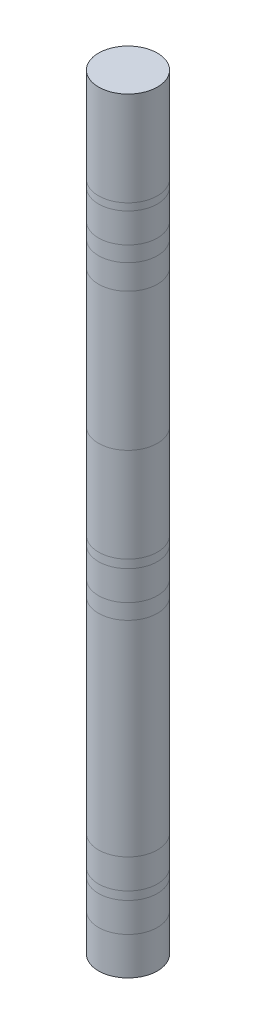
ISO-10303-21;
HEADER;
FILE_DESCRIPTION(('STEP AP214'),'2;1');
FILE_NAME('part.step','',(''),(''),'','','');
FILE_SCHEMA(('AUTOMOTIVE_DESIGN { 1 0 10303 214 1 1 1 1 }'));
ENDSEC;
DATA;
#1=APPLICATION_CONTEXT('core data for automotive mechanical design processes');
#2=APPLICATION_PROTOCOL_DEFINITION('international standard','automotive_design',2000,#1);
#3=PRODUCT_CONTEXT('',#1,'mechanical');
#4=PRODUCT('Part','Part','',(#3));
#5=PRODUCT_RELATED_PRODUCT_CATEGORY('part','',(#4));
#6=PRODUCT_DEFINITION_FORMATION('','',#4);
#7=PRODUCT_DEFINITION_CONTEXT('part definition',#1,'design');
#8=PRODUCT_DEFINITION('design','',#6,#7);
#9=PRODUCT_DEFINITION_SHAPE('','',#8);
#10=(LENGTH_UNIT() NAMED_UNIT(*) SI_UNIT(.MILLI.,.METRE.));
#11=(NAMED_UNIT(*) PLANE_ANGLE_UNIT() SI_UNIT($,.RADIAN.));
#12=(NAMED_UNIT(*) SI_UNIT($,.STERADIAN.) SOLID_ANGLE_UNIT());
#13=UNCERTAINTY_MEASURE_WITH_UNIT(LENGTH_MEASURE(1.E-05),#10,'distance_accuracy_value','');
#14=(GEOMETRIC_REPRESENTATION_CONTEXT(3) GLOBAL_UNCERTAINTY_ASSIGNED_CONTEXT((#13)) GLOBAL_UNIT_ASSIGNED_CONTEXT((#10,
#11,#12)) REPRESENTATION_CONTEXT('',''));
#15=CARTESIAN_POINT('',(0.,0.,0.));
#16=DIRECTION('',(0.,0.,1.));
#17=DIRECTION('',(1.,0.,0.));
#18=AXIS2_PLACEMENT_3D('',#15,#16,#17);
#19=CARTESIAN_POINT('',(0.,165.1,0.));
#20=DIRECTION('',(0.,-1.,0.));
#21=DIRECTION('',(0.,0.,-1.));
#22=AXIS2_PLACEMENT_3D('',#19,#20,#21);
#23=CYLINDRICAL_SURFACE('',#22,6.35);
#24=CARTESIAN_POINT('',(0.,143.256,0.));
#25=DIRECTION('',(0.,1.,0.));
#26=DIRECTION('',(0.,0.,1.));
#27=AXIS2_PLACEMENT_3D('',#24,#25,#26);
#28=CIRCLE('',#27,6.35);
#29=CARTESIAN_POINT('',(0.,143.256,6.35));
#30=VERTEX_POINT('',#29);
#31=EDGE_CURVE('E73',#30,#30,#28,.T.);
#32=ORIENTED_EDGE('',*,*,#31,.F.);
#33=EDGE_LOOP('',(#32));
#34=FACE_BOUND('',#33,.T.);
#35=CARTESIAN_POINT('',(0.,136.906,0.));
#36=DIRECTION('',(0.,1.,0.));
#37=DIRECTION('',(0.,0.,1.));
#38=AXIS2_PLACEMENT_3D('',#35,#36,#37);
#39=CIRCLE('',#38,6.35);
#40=CARTESIAN_POINT('',(0.,136.906,6.35));
#41=VERTEX_POINT('',#40);
#42=EDGE_CURVE('E11',#41,#41,#39,.T.);
#43=ORIENTED_EDGE('',*,*,#42,.T.);
#44=EDGE_LOOP('',(#43));
#45=FACE_BOUND('',#44,.T.);
#46=ADVANCED_FACE('F58',(#34,#45),#23,.T.);
#47=ORIENTED_EDGE('',*,*,#42,.F.);
#48=EDGE_LOOP('',(#47));
#49=FACE_BOUND('',#48,.T.);
#50=CARTESIAN_POINT('',(0.,133.604,0.));
#51=DIRECTION('',(0.,1.,0.));
#52=DIRECTION('',(0.,0.,1.));
#53=AXIS2_PLACEMENT_3D('',#50,#51,#52);
#54=CIRCLE('',#53,6.35);
#55=CARTESIAN_POINT('',(0.,133.604,6.35));
#56=VERTEX_POINT('',#55);
#57=EDGE_CURVE('E66',#56,#56,#54,.T.);
#58=ORIENTED_EDGE('',*,*,#57,.T.);
#59=EDGE_LOOP('',(#58));
#60=FACE_BOUND('',#59,.T.);
#61=ADVANCED_FACE('F142',(#49,#60),#23,.T.);
#62=CARTESIAN_POINT('',(0.,144.78,0.));
#63=DIRECTION('',(0.,1.,0.));
#64=DIRECTION('',(0.,0.,1.));
#65=AXIS2_PLACEMENT_3D('',#62,#63,#64);
#66=CIRCLE('',#65,6.35);
#67=CARTESIAN_POINT('',(0.,144.78,6.35));
#68=VERTEX_POINT('',#67);
#69=EDGE_CURVE('E79',#68,#68,#66,.T.);
#70=ORIENTED_EDGE('',*,*,#69,.F.);
#71=EDGE_LOOP('',(#70));
#72=FACE_BOUND('',#71,.T.);
#73=ORIENTED_EDGE('',*,*,#31,.T.);
#74=EDGE_LOOP('',(#73));
#75=FACE_BOUND('',#74,.T.);
#76=ADVANCED_FACE('F137',(#72,#75),#23,.T.);
#77=CARTESIAN_POINT('',(0.,165.1,0.));
#78=DIRECTION('',(0.,1.,0.));
#79=DIRECTION('',(0.,0.,1.));
#80=AXIS2_PLACEMENT_3D('',#77,#78,#79);
#81=CIRCLE('',#80,6.35);
#82=CARTESIAN_POINT('',(0.,165.1,6.35));
#83=VERTEX_POINT('',#82);
#84=EDGE_CURVE('E123',#83,#83,#81,.T.);
#85=ORIENTED_EDGE('',*,*,#84,.F.);
#86=EDGE_LOOP('',(#85));
#87=FACE_BOUND('',#86,.T.);
#88=ORIENTED_EDGE('',*,*,#69,.T.);
#89=EDGE_LOOP('',(#88));
#90=FACE_BOUND('',#89,.T.);
#91=ADVANCED_FACE('F133',(#87,#90),#23,.T.);
#92=ORIENTED_EDGE('',*,*,#57,.F.);
#93=EDGE_LOOP('',(#92));
#94=FACE_BOUND('',#93,.T.);
#95=CARTESIAN_POINT('',(0.,128.27,0.));
#96=DIRECTION('',(0.,1.,0.));
#97=DIRECTION('',(0.,0.,1.));
#98=AXIS2_PLACEMENT_3D('',#95,#96,#97);
#99=CIRCLE('',#98,6.35);
#100=CARTESIAN_POINT('',(0.,128.27,6.35));
#101=VERTEX_POINT('',#100);
#102=EDGE_CURVE('E85',#101,#101,#99,.T.);
#103=ORIENTED_EDGE('',*,*,#102,.T.);
#104=EDGE_LOOP('',(#103));
#105=FACE_BOUND('',#104,.T.);
#106=ADVANCED_FACE('F136',(#94,#105),#23,.T.);
#107=CARTESIAN_POINT('',(0.,98.552,0.));
#108=DIRECTION('',(0.,1.,0.));
#109=DIRECTION('',(0.,0.,1.));
#110=AXIS2_PLACEMENT_3D('',#107,#108,#109);
#111=CIRCLE('',#110,6.35);
#112=CARTESIAN_POINT('',(0.,98.552,6.35));
#113=VERTEX_POINT('',#112);
#114=EDGE_CURVE('E93',#113,#113,#111,.T.);
#115=ORIENTED_EDGE('',*,*,#114,.F.);
#116=EDGE_LOOP('',(#115));
#117=FACE_BOUND('',#116,.T.);
#118=CARTESIAN_POINT('',(0.,78.232,0.));
#119=DIRECTION('',(0.,1.,0.));
#120=DIRECTION('',(0.,0.,1.));
#121=AXIS2_PLACEMENT_3D('',#118,#119,#120);
#122=CIRCLE('',#121,6.35);
#123=CARTESIAN_POINT('',(0.,78.232,6.35));
#124=VERTEX_POINT('',#123);
#125=EDGE_CURVE('E89',#124,#124,#122,.T.);
#126=ORIENTED_EDGE('',*,*,#125,.T.);
#127=EDGE_LOOP('',(#126));
#128=FACE_BOUND('',#127,.T.);
#129=ADVANCED_FACE('F234',(#117,#128),#23,.T.);
#130=ORIENTED_EDGE('',*,*,#102,.F.);
#131=EDGE_LOOP('',(#130));
#132=FACE_BOUND('',#131,.T.);
#133=ORIENTED_EDGE('',*,*,#114,.T.);
#134=EDGE_LOOP('',(#133));
#135=FACE_BOUND('',#134,.T.);
#136=ADVANCED_FACE('F226',(#132,#135),#23,.T.);
#137=ORIENTED_EDGE('',*,*,#125,.F.);
#138=EDGE_LOOP('',(#137));
#139=FACE_BOUND('',#138,.T.);
#140=CARTESIAN_POINT('',(0.,76.454,0.));
#141=DIRECTION('',(0.,1.,0.));
#142=DIRECTION('',(0.,0.,1.));
#143=AXIS2_PLACEMENT_3D('',#140,#141,#142);
#144=CIRCLE('',#143,6.35);
#145=CARTESIAN_POINT('',(0.,76.454,6.35));
#146=VERTEX_POINT('',#145);
#147=EDGE_CURVE('E97',#146,#146,#144,.T.);
#148=ORIENTED_EDGE('',*,*,#147,.T.);
#149=EDGE_LOOP('',(#148));
#150=FACE_BOUND('',#149,.T.);
#151=ADVANCED_FACE('F218',(#139,#150),#23,.T.);
#152=ORIENTED_EDGE('',*,*,#147,.F.);
#153=EDGE_LOOP('',(#152));
#154=FACE_BOUND('',#153,.T.);
#155=CARTESIAN_POINT('',(0.,70.104,0.));
#156=DIRECTION('',(0.,1.,0.));
#157=DIRECTION('',(0.,0.,1.));
#158=AXIS2_PLACEMENT_3D('',#155,#156,#157);
#159=CIRCLE('',#158,6.35);
#160=CARTESIAN_POINT('',(0.,70.104,6.35));
#161=VERTEX_POINT('',#160);
#162=EDGE_CURVE('E101',#161,#161,#159,.T.);
#163=ORIENTED_EDGE('',*,*,#162,.T.);
#164=EDGE_LOOP('',(#163));
#165=FACE_BOUND('',#164,.T.);
#166=ADVANCED_FACE('F210',(#154,#165),#23,.T.);
#167=ORIENTED_EDGE('',*,*,#162,.F.);
#168=EDGE_LOOP('',(#167));
#169=FACE_BOUND('',#168,.T.);
#170=CARTESIAN_POINT('',(0.,66.802,0.));
#171=DIRECTION('',(0.,1.,0.));
#172=DIRECTION('',(0.,0.,1.));
#173=AXIS2_PLACEMENT_3D('',#170,#171,#172);
#174=CIRCLE('',#173,6.35);
#175=CARTESIAN_POINT('',(0.,66.802,6.35));
#176=VERTEX_POINT('',#175);
#177=EDGE_CURVE('E105',#176,#176,#174,.T.);
#178=ORIENTED_EDGE('',*,*,#177,.T.);
#179=EDGE_LOOP('',(#178));
#180=FACE_BOUND('',#179,.T.);
#181=ADVANCED_FACE('F202',(#169,#180),#23,.T.);
#182=ORIENTED_EDGE('',*,*,#177,.F.);
#183=EDGE_LOOP('',(#182));
#184=FACE_BOUND('',#183,.T.);
#185=CARTESIAN_POINT('',(0.,22.606,0.));
#186=DIRECTION('',(0.,1.,0.));
#187=DIRECTION('',(0.,0.,1.));
#188=AXIS2_PLACEMENT_3D('',#185,#186,#187);
#189=CIRCLE('',#188,6.35);
#190=CARTESIAN_POINT('',(0.,22.606,6.35));
#191=VERTEX_POINT('',#190);
#192=EDGE_CURVE('E108',#191,#191,#189,.T.);
#193=ORIENTED_EDGE('',*,*,#192,.T.);
#194=EDGE_LOOP('',(#193));
#195=FACE_BOUND('',#194,.T.);
#196=ADVANCED_FACE('F194',(#184,#195),#23,.T.);
#197=ORIENTED_EDGE('',*,*,#192,.F.);
#198=EDGE_LOOP('',(#197));
#199=FACE_BOUND('',#198,.T.);
#200=CARTESIAN_POINT('',(0.,16.256,0.));
#201=DIRECTION('',(0.,1.,0.));
#202=DIRECTION('',(0.,0.,1.));
#203=AXIS2_PLACEMENT_3D('',#200,#201,#202);
#204=CIRCLE('',#203,6.35);
#205=CARTESIAN_POINT('',(0.,16.256,6.35));
#206=VERTEX_POINT('',#205);
#207=EDGE_CURVE('E112',#206,#206,#204,.T.);
#208=ORIENTED_EDGE('',*,*,#207,.T.);
#209=EDGE_LOOP('',(#208));
#210=FACE_BOUND('',#209,.T.);
#211=ADVANCED_FACE('F186',(#199,#210),#23,.T.);
#212=ORIENTED_EDGE('',*,*,#207,.F.);
#213=EDGE_LOOP('',(#212));
#214=FACE_BOUND('',#213,.T.);
#215=CARTESIAN_POINT('',(0.,14.478,0.));
#216=DIRECTION('',(0.,1.,0.));
#217=DIRECTION('',(0.,0.,1.));
#218=AXIS2_PLACEMENT_3D('',#215,#216,#217);
#219=CIRCLE('',#218,6.35);
#220=CARTESIAN_POINT('',(0.,14.478,6.35));
#221=VERTEX_POINT('',#220);
#222=EDGE_CURVE('E116',#221,#221,#219,.T.);
#223=ORIENTED_EDGE('',*,*,#222,.T.);
#224=EDGE_LOOP('',(#223));
#225=FACE_BOUND('',#224,.T.);
#226=ADVANCED_FACE('F159',(#214,#225),#23,.T.);
#227=ORIENTED_EDGE('',*,*,#222,.F.);
#228=EDGE_LOOP('',(#227));
#229=FACE_BOUND('',#228,.T.);
#230=CARTESIAN_POINT('',(0.,8.128,0.));
#231=DIRECTION('',(0.,1.,0.));
#232=DIRECTION('',(0.,0.,1.));
#233=AXIS2_PLACEMENT_3D('',#230,#231,#232);
#234=CIRCLE('',#233,6.35);
#235=CARTESIAN_POINT('',(0.,8.128,6.35));
#236=VERTEX_POINT('',#235);
#237=EDGE_CURVE('E120',#236,#236,#234,.T.);
#238=ORIENTED_EDGE('',*,*,#237,.T.);
#239=EDGE_LOOP('',(#238));
#240=FACE_BOUND('',#239,.T.);
#241=ADVANCED_FACE('F151',(#229,#240),#23,.T.);
#242=ORIENTED_EDGE('',*,*,#237,.F.);
#243=EDGE_LOOP('',(#242));
#244=FACE_BOUND('',#243,.T.);
#245=CARTESIAN_POINT('',(0.,0.,0.));
#246=DIRECTION('',(0.,1.,0.));
#247=DIRECTION('',(0.,0.,1.));
#248=AXIS2_PLACEMENT_3D('',#245,#246,#247);
#249=CIRCLE('',#248,6.35);
#250=CARTESIAN_POINT('',(0.,0.,6.35));
#251=VERTEX_POINT('',#250);
#252=EDGE_CURVE('E124',#251,#251,#249,.T.);
#253=ORIENTED_EDGE('',*,*,#252,.T.);
#254=EDGE_LOOP('',(#253));
#255=FACE_BOUND('',#254,.T.);
#256=ADVANCED_FACE('F60',(#244,#255),#23,.T.);
#257=CARTESIAN_POINT('',(0.,165.1,0.));
#258=DIRECTION('',(0.,1.,0.));
#259=DIRECTION('',(0.,0.,1.));
#260=AXIS2_PLACEMENT_3D('',#257,#258,#259);
#261=PLANE('',#260);
#262=ORIENTED_EDGE('',*,*,#84,.T.);
#263=EDGE_LOOP('',(#262));
#264=FACE_BOUND('',#263,.T.);
#265=ADVANCED_FACE('F131',(#264),#261,.T.);
#266=CARTESIAN_POINT('',(0.,0.,0.));
#267=DIRECTION('',(0.,1.,0.));
#268=DIRECTION('',(0.,0.,1.));
#269=AXIS2_PLACEMENT_3D('',#266,#267,#268);
#270=PLANE('',#269);
#271=ORIENTED_EDGE('',*,*,#252,.F.);
#272=EDGE_LOOP('',(#271));
#273=FACE_BOUND('',#272,.T.);
#274=ADVANCED_FACE('F157',(#273),#270,.F.);
#275=CLOSED_SHELL('',(#46,#61,#76,#91,#106,#129,#136,#151,#166,#181,#196,#211,#226,#241,#256,
#265,#274));
#276=MANIFOLD_SOLID_BREP('B2',#275);
#277=ADVANCED_BREP_SHAPE_REPRESENTATION('',(#18,#276),#14);
#278=SHAPE_DEFINITION_REPRESENTATION(#9,#277);
ENDSEC;
END-ISO-10303-21;
